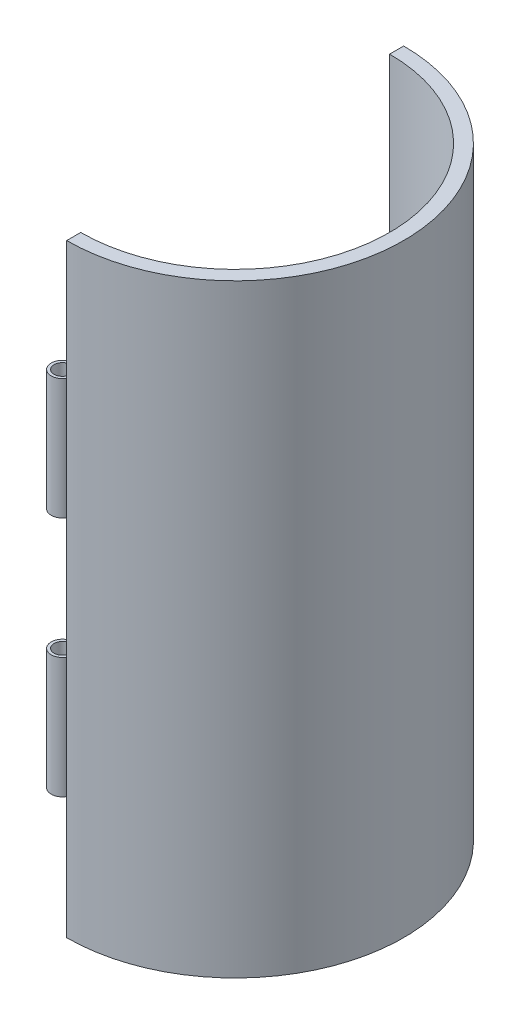
ISO-10303-21;
HEADER;
FILE_DESCRIPTION(('STEP AP214'),'2;1');
FILE_NAME('part.step','',(''),(''),'','','');
FILE_SCHEMA(('AUTOMOTIVE_DESIGN { 1 0 10303 214 1 1 1 1 }'));
ENDSEC;
DATA;
#1=APPLICATION_CONTEXT('core data for automotive mechanical design processes');
#2=APPLICATION_PROTOCOL_DEFINITION('international standard','automotive_design',2000,#1);
#3=PRODUCT_CONTEXT('',#1,'mechanical');
#4=PRODUCT('Part','Part','',(#3));
#5=PRODUCT_RELATED_PRODUCT_CATEGORY('part','',(#4));
#6=PRODUCT_DEFINITION_FORMATION('','',#4);
#7=PRODUCT_DEFINITION_CONTEXT('part definition',#1,'design');
#8=PRODUCT_DEFINITION('design','',#6,#7);
#9=PRODUCT_DEFINITION_SHAPE('','',#8);
#10=(LENGTH_UNIT() NAMED_UNIT(*) SI_UNIT(.MILLI.,.METRE.));
#11=(NAMED_UNIT(*) PLANE_ANGLE_UNIT() SI_UNIT($,.RADIAN.));
#12=(NAMED_UNIT(*) SI_UNIT($,.STERADIAN.) SOLID_ANGLE_UNIT());
#13=UNCERTAINTY_MEASURE_WITH_UNIT(LENGTH_MEASURE(1.E-05),#10,'distance_accuracy_value','');
#14=(GEOMETRIC_REPRESENTATION_CONTEXT(3) GLOBAL_UNCERTAINTY_ASSIGNED_CONTEXT((#13)) GLOBAL_UNIT_ASSIGNED_CONTEXT((#10,
#11,#12)) REPRESENTATION_CONTEXT('',''));
#15=CARTESIAN_POINT('',(0.,0.,0.));
#16=DIRECTION('',(0.,0.,1.));
#17=DIRECTION('',(1.,0.,0.));
#18=AXIS2_PLACEMENT_3D('',#15,#16,#17);
#19=CARTESIAN_POINT('',(-2.,86.,28.75));
#20=DIRECTION('',(0.,-1.,0.));
#21=DIRECTION('',(0.,0.,-1.));
#22=AXIS2_PLACEMENT_3D('',#19,#20,#21);
#23=CYLINDRICAL_SURFACE('',#22,2.);
#24=CARTESIAN_POINT('',(-2.,86.,28.75));
#25=DIRECTION('',(0.,-1.,0.));
#26=DIRECTION('',(0.,0.,-1.));
#27=AXIS2_PLACEMENT_3D('',#24,#25,#26);
#28=CIRCLE('',#27,2.);
#29=CARTESIAN_POINT('',(-2.,86.,26.75));
#30=VERTEX_POINT('',#29);
#31=EDGE_CURVE('E11',#30,#30,#28,.T.);
#32=ORIENTED_EDGE('',*,*,#31,.T.);
#33=EDGE_LOOP('',(#32));
#34=FACE_BOUND('',#33,.T.);
#35=CARTESIAN_POINT('',(-2.,64.5,28.75));
#36=DIRECTION('',(0.,-1.,0.));
#37=DIRECTION('',(0.,0.,-1.));
#38=AXIS2_PLACEMENT_3D('',#35,#36,#37);
#39=CIRCLE('',#38,2.);
#40=CARTESIAN_POINT('',(-2.,64.5,26.75));
#41=VERTEX_POINT('',#40);
#42=EDGE_CURVE('E49',#41,#41,#39,.T.);
#43=ORIENTED_EDGE('',*,*,#42,.F.);
#44=EDGE_LOOP('',(#43));
#45=FACE_BOUND('',#44,.T.);
#46=ADVANCED_FACE('F46',(#34,#45),#23,.T.);
#47=CARTESIAN_POINT('',(-2.,86.,28.75));
#48=DIRECTION('',(0.,-1.,0.));
#49=DIRECTION('',(0.,0.,-1.));
#50=AXIS2_PLACEMENT_3D('',#47,#48,#49);
#51=PLANE('',#50);
#52=CARTESIAN_POINT('',(-2.,86.,28.75));
#53=DIRECTION('',(0.,-1.,0.));
#54=DIRECTION('',(0.,0.,-1.));
#55=AXIS2_PLACEMENT_3D('',#52,#53,#54);
#56=CIRCLE('',#55,1.5);
#57=CARTESIAN_POINT('',(-2.,86.,27.25));
#58=VERTEX_POINT('',#57);
#59=EDGE_CURVE('E56',#58,#58,#56,.T.);
#60=ORIENTED_EDGE('',*,*,#59,.T.);
#61=EDGE_LOOP('',(#60));
#62=FACE_BOUND('',#61,.T.);
#63=ORIENTED_EDGE('',*,*,#31,.F.);
#64=EDGE_LOOP('',(#63));
#65=FACE_BOUND('',#64,.T.);
#66=ADVANCED_FACE('F64',(#62,#65),#51,.F.);
#67=CARTESIAN_POINT('',(-2.,64.5,28.75));
#68=DIRECTION('',(0.,-1.,0.));
#69=DIRECTION('',(0.,0.,-1.));
#70=AXIS2_PLACEMENT_3D('',#67,#68,#69);
#71=PLANE('',#70);
#72=CARTESIAN_POINT('',(-2.,64.5,28.75));
#73=DIRECTION('',(0.,-1.,0.));
#74=DIRECTION('',(0.,0.,-1.));
#75=AXIS2_PLACEMENT_3D('',#72,#73,#74);
#76=CIRCLE('',#75,1.5);
#77=CARTESIAN_POINT('',(-2.,64.5,27.25));
#78=VERTEX_POINT('',#77);
#79=EDGE_CURVE('E58',#78,#78,#76,.T.);
#80=ORIENTED_EDGE('',*,*,#79,.F.);
#81=EDGE_LOOP('',(#80));
#82=FACE_BOUND('',#81,.T.);
#83=ORIENTED_EDGE('',*,*,#42,.T.);
#84=EDGE_LOOP('',(#83));
#85=FACE_BOUND('',#84,.T.);
#86=ADVANCED_FACE('F70',(#82,#85),#71,.T.);
#87=CARTESIAN_POINT('',(-2.,86.,28.75));
#88=DIRECTION('',(0.,-1.,0.));
#89=DIRECTION('',(0.,0.,-1.));
#90=AXIS2_PLACEMENT_3D('',#87,#88,#89);
#91=CYLINDRICAL_SURFACE('',#90,1.5);
#92=ORIENTED_EDGE('',*,*,#59,.F.);
#93=EDGE_LOOP('',(#92));
#94=FACE_BOUND('',#93,.T.);
#95=ORIENTED_EDGE('',*,*,#79,.T.);
#96=EDGE_LOOP('',(#95));
#97=FACE_BOUND('',#96,.T.);
#98=ADVANCED_FACE('F67',(#94,#97),#91,.F.);
#99=CLOSED_SHELL('',(#46,#66,#86,#98));
#100=MANIFOLD_SOLID_BREP('B2',#99);
#101=CARTESIAN_POINT('',(-2.,43.,28.75));
#102=DIRECTION('',(0.,-1.,0.));
#103=DIRECTION('',(0.,0.,-1.));
#104=AXIS2_PLACEMENT_3D('',#101,#102,#103);
#105=CYLINDRICAL_SURFACE('',#104,2.);
#106=CARTESIAN_POINT('',(-2.,43.,28.75));
#107=DIRECTION('',(0.,-1.,0.));
#108=DIRECTION('',(0.,0.,-1.));
#109=AXIS2_PLACEMENT_3D('',#106,#107,#108);
#110=CIRCLE('',#109,2.);
#111=CARTESIAN_POINT('',(-2.,43.,26.75));
#112=VERTEX_POINT('',#111);
#113=EDGE_CURVE('E45',#112,#112,#110,.T.);
#114=ORIENTED_EDGE('',*,*,#113,.T.);
#115=EDGE_LOOP('',(#114));
#116=FACE_BOUND('',#115,.T.);
#117=CARTESIAN_POINT('',(-2.,21.5,28.75));
#118=DIRECTION('',(0.,-1.,0.));
#119=DIRECTION('',(0.,0.,-1.));
#120=AXIS2_PLACEMENT_3D('',#117,#118,#119);
#121=CIRCLE('',#120,2.);
#122=CARTESIAN_POINT('',(-2.,21.5,26.75));
#123=VERTEX_POINT('',#122);
#124=EDGE_CURVE('E128',#123,#123,#121,.T.);
#125=ORIENTED_EDGE('',*,*,#124,.F.);
#126=EDGE_LOOP('',(#125));
#127=FACE_BOUND('',#126,.T.);
#128=ADVANCED_FACE('F125',(#116,#127),#105,.T.);
#129=CARTESIAN_POINT('',(-2.,43.,28.75));
#130=DIRECTION('',(0.,-1.,0.));
#131=DIRECTION('',(0.,0.,-1.));
#132=AXIS2_PLACEMENT_3D('',#129,#130,#131);
#133=PLANE('',#132);
#134=CARTESIAN_POINT('',(-2.,43.,28.75));
#135=DIRECTION('',(0.,-1.,0.));
#136=DIRECTION('',(0.,0.,-1.));
#137=AXIS2_PLACEMENT_3D('',#134,#135,#136);
#138=CIRCLE('',#137,1.5);
#139=CARTESIAN_POINT('',(-2.,43.,27.25));
#140=VERTEX_POINT('',#139);
#141=EDGE_CURVE('E135',#140,#140,#138,.T.);
#142=ORIENTED_EDGE('',*,*,#141,.T.);
#143=EDGE_LOOP('',(#142));
#144=FACE_BOUND('',#143,.T.);
#145=ORIENTED_EDGE('',*,*,#113,.F.);
#146=EDGE_LOOP('',(#145));
#147=FACE_BOUND('',#146,.T.);
#148=ADVANCED_FACE('F143',(#144,#147),#133,.F.);
#149=CARTESIAN_POINT('',(-2.,21.5,28.75));
#150=DIRECTION('',(0.,-1.,0.));
#151=DIRECTION('',(0.,0.,-1.));
#152=AXIS2_PLACEMENT_3D('',#149,#150,#151);
#153=PLANE('',#152);
#154=CARTESIAN_POINT('',(-2.,21.5,28.75));
#155=DIRECTION('',(0.,-1.,0.));
#156=DIRECTION('',(0.,0.,-1.));
#157=AXIS2_PLACEMENT_3D('',#154,#155,#156);
#158=CIRCLE('',#157,1.5);
#159=CARTESIAN_POINT('',(-2.,21.5,27.25));
#160=VERTEX_POINT('',#159);
#161=EDGE_CURVE('E137',#160,#160,#158,.T.);
#162=ORIENTED_EDGE('',*,*,#161,.F.);
#163=EDGE_LOOP('',(#162));
#164=FACE_BOUND('',#163,.T.);
#165=ORIENTED_EDGE('',*,*,#124,.T.);
#166=EDGE_LOOP('',(#165));
#167=FACE_BOUND('',#166,.T.);
#168=ADVANCED_FACE('F149',(#164,#167),#153,.T.);
#169=CARTESIAN_POINT('',(-2.,43.,28.75));
#170=DIRECTION('',(0.,-1.,0.));
#171=DIRECTION('',(0.,0.,-1.));
#172=AXIS2_PLACEMENT_3D('',#169,#170,#171);
#173=CYLINDRICAL_SURFACE('',#172,1.5);
#174=ORIENTED_EDGE('',*,*,#141,.F.);
#175=EDGE_LOOP('',(#174));
#176=FACE_BOUND('',#175,.T.);
#177=ORIENTED_EDGE('',*,*,#161,.T.);
#178=EDGE_LOOP('',(#177));
#179=FACE_BOUND('',#178,.T.);
#180=ADVANCED_FACE('F146',(#176,#179),#173,.F.);
#181=CLOSED_SHELL('',(#128,#148,#168,#180));
#182=MANIFOLD_SOLID_BREP('B6',#181);
#183=CARTESIAN_POINT('',(0.,107.5,0.));
#184=DIRECTION('',(0.,-1.,0.));
#185=DIRECTION('',(0.,0.,-1.));
#186=AXIS2_PLACEMENT_3D('',#183,#184,#185);
#187=CYLINDRICAL_SURFACE('',#186,27.5);
#188=CARTESIAN_POINT('',(0.,0.,0.));
#189=DIRECTION('',(0.,1.,0.));
#190=DIRECTION('',(0.,0.,1.));
#191=AXIS2_PLACEMENT_3D('',#188,#189,#190);
#192=CIRCLE('',#191,27.5);
#193=CARTESIAN_POINT('',(0.,0.,27.5));
#194=VERTEX_POINT('',#193);
#195=CARTESIAN_POINT('',(0.,0.,-27.5));
#196=VERTEX_POINT('',#195);
#197=EDGE_CURVE('E256',#194,#196,#192,.T.);
#198=ORIENTED_EDGE('',*,*,#197,.F.);
#199=DIRECTION('',(0.,-1.,0.));
#200=VECTOR('',#199,1.);
#201=CARTESIAN_POINT('',(0.,107.5,27.5));
#202=LINE('',#201,#200);
#203=CARTESIAN_POINT('',(0.,107.5,27.5));
#204=VERTEX_POINT('',#203);
#205=EDGE_CURVE('E123',#204,#194,#202,.T.);
#206=ORIENTED_EDGE('',*,*,#205,.F.);
#207=CARTESIAN_POINT('',(0.,107.5,0.));
#208=DIRECTION('',(0.,1.,0.));
#209=DIRECTION('',(0.,0.,1.));
#210=AXIS2_PLACEMENT_3D('',#207,#208,#209);
#211=CIRCLE('',#210,27.5);
#212=CARTESIAN_POINT('',(0.,107.5,-27.5));
#213=VERTEX_POINT('',#212);
#214=EDGE_CURVE('E245',#204,#213,#211,.T.);
#215=ORIENTED_EDGE('',*,*,#214,.T.);
#216=DIRECTION('',(0.,-1.,0.));
#217=VECTOR('',#216,1.);
#218=CARTESIAN_POINT('',(0.,107.5,-27.5));
#219=LINE('',#218,#217);
#220=EDGE_CURVE('E234',#213,#196,#219,.T.);
#221=ORIENTED_EDGE('',*,*,#220,.T.);
#222=EDGE_LOOP('',(#198,#206,#215,#221));
#223=FACE_BOUND('',#222,.T.);
#224=ADVANCED_FACE('F195',(#223),#187,.F.);
#225=CARTESIAN_POINT('',(0.,107.5,0.));
#226=DIRECTION('',(1.,0.,0.));
#227=DIRECTION('',(0.,0.,-1.));
#228=AXIS2_PLACEMENT_3D('',#225,#226,#227);
#229=PLANE('',#228);
#230=DIRECTION('',(0.,0.,1.));
#231=VECTOR('',#230,1.);
#232=CARTESIAN_POINT('',(0.,0.,0.));
#233=LINE('',#232,#231);
#234=CARTESIAN_POINT('',(0.,0.,30.));
#235=VERTEX_POINT('',#234);
#236=EDGE_CURVE('E250',#194,#235,#233,.T.);
#237=ORIENTED_EDGE('',*,*,#236,.T.);
#238=DIRECTION('',(0.,-1.,0.));
#239=VECTOR('',#238,1.);
#240=CARTESIAN_POINT('',(0.,107.5,30.));
#241=LINE('',#240,#239);
#242=CARTESIAN_POINT('',(0.,107.5,30.));
#243=VERTEX_POINT('',#242);
#244=EDGE_CURVE('E203',#243,#235,#241,.T.);
#245=ORIENTED_EDGE('',*,*,#244,.F.);
#246=DIRECTION('',(0.,0.,1.));
#247=VECTOR('',#246,1.);
#248=CARTESIAN_POINT('',(0.,107.5,0.));
#249=LINE('',#248,#247);
#250=EDGE_CURVE('E240',#204,#243,#249,.T.);
#251=ORIENTED_EDGE('',*,*,#250,.F.);
#252=ORIENTED_EDGE('',*,*,#205,.T.);
#253=EDGE_LOOP('',(#237,#245,#251,#252));
#254=FACE_BOUND('',#253,.T.);
#255=ADVANCED_FACE('F248',(#254),#229,.F.);
#256=CARTESIAN_POINT('',(0.,107.5,0.));
#257=DIRECTION('',(0.,-1.,0.));
#258=DIRECTION('',(0.,0.,-1.));
#259=AXIS2_PLACEMENT_3D('',#256,#257,#258);
#260=CYLINDRICAL_SURFACE('',#259,30.);
#261=CARTESIAN_POINT('',(0.,0.,0.));
#262=DIRECTION('',(0.,1.,0.));
#263=DIRECTION('',(0.,0.,1.));
#264=AXIS2_PLACEMENT_3D('',#261,#262,#263);
#265=CIRCLE('',#264,30.);
#266=CARTESIAN_POINT('',(0.,0.,-30.));
#267=VERTEX_POINT('',#266);
#268=EDGE_CURVE('E227',#235,#267,#265,.T.);
#269=ORIENTED_EDGE('',*,*,#268,.T.);
#270=DIRECTION('',(0.,-1.,0.));
#271=VECTOR('',#270,1.);
#272=CARTESIAN_POINT('',(0.,107.5,-30.));
#273=LINE('',#272,#271);
#274=CARTESIAN_POINT('',(0.,107.5,-30.));
#275=VERTEX_POINT('',#274);
#276=EDGE_CURVE('E251',#275,#267,#273,.T.);
#277=ORIENTED_EDGE('',*,*,#276,.F.);
#278=CARTESIAN_POINT('',(0.,107.5,0.));
#279=DIRECTION('',(0.,1.,0.));
#280=DIRECTION('',(0.,0.,1.));
#281=AXIS2_PLACEMENT_3D('',#278,#279,#280);
#282=CIRCLE('',#281,30.);
#283=EDGE_CURVE('E244',#243,#275,#282,.T.);
#284=ORIENTED_EDGE('',*,*,#283,.F.);
#285=ORIENTED_EDGE('',*,*,#244,.T.);
#286=EDGE_LOOP('',(#269,#277,#284,#285));
#287=FACE_BOUND('',#286,.T.);
#288=ADVANCED_FACE('F252',(#287),#260,.T.);
#289=EDGE_CURVE('E260',#267,#196,#233,.T.);
#290=ORIENTED_EDGE('',*,*,#289,.T.);
#291=ORIENTED_EDGE('',*,*,#220,.F.);
#292=EDGE_CURVE('E211',#275,#213,#249,.T.);
#293=ORIENTED_EDGE('',*,*,#292,.F.);
#294=ORIENTED_EDGE('',*,*,#276,.T.);
#295=EDGE_LOOP('',(#290,#291,#293,#294));
#296=FACE_BOUND('',#295,.T.);
#297=ADVANCED_FACE('F265',(#296),#229,.F.);
#298=CARTESIAN_POINT('',(0.,107.5,0.));
#299=DIRECTION('',(0.,1.,0.));
#300=DIRECTION('',(0.,0.,1.));
#301=AXIS2_PLACEMENT_3D('',#298,#299,#300);
#302=PLANE('',#301);
#303=ORIENTED_EDGE('',*,*,#214,.F.);
#304=ORIENTED_EDGE('',*,*,#250,.T.);
#305=ORIENTED_EDGE('',*,*,#283,.T.);
#306=ORIENTED_EDGE('',*,*,#292,.T.);
#307=EDGE_LOOP('',(#303,#304,#305,#306));
#308=FACE_BOUND('',#307,.T.);
#309=ADVANCED_FACE('F242',(#308),#302,.T.);
#310=CARTESIAN_POINT('',(0.,0.,0.));
#311=DIRECTION('',(0.,1.,0.));
#312=DIRECTION('',(0.,0.,1.));
#313=AXIS2_PLACEMENT_3D('',#310,#311,#312);
#314=PLANE('',#313);
#315=ORIENTED_EDGE('',*,*,#197,.T.);
#316=ORIENTED_EDGE('',*,*,#289,.F.);
#317=ORIENTED_EDGE('',*,*,#268,.F.);
#318=ORIENTED_EDGE('',*,*,#236,.F.);
#319=EDGE_LOOP('',(#315,#316,#317,#318));
#320=FACE_BOUND('',#319,.T.);
#321=ADVANCED_FACE('F267',(#320),#314,.F.);
#322=CLOSED_SHELL('',(#224,#255,#288,#297,#309,#321));
#323=MANIFOLD_SOLID_BREP('B40',#322);
#324=ADVANCED_BREP_SHAPE_REPRESENTATION('',(#18,#100,#182,#323),#14);
#325=SHAPE_DEFINITION_REPRESENTATION(#9,#324);
ENDSEC;
END-ISO-10303-21;
